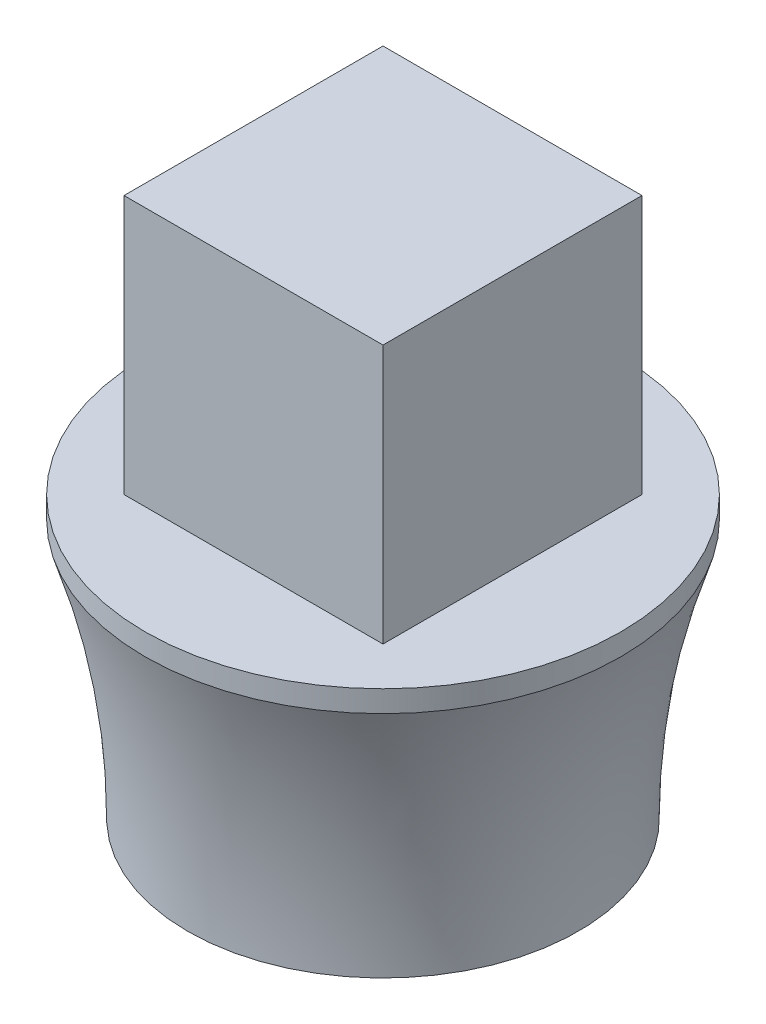
ISO-10303-21;
HEADER;
FILE_DESCRIPTION(('STEP AP214'),'2;1');
FILE_NAME('part.step','',(''),(''),'','','');
FILE_SCHEMA(('AUTOMOTIVE_DESIGN { 1 0 10303 214 1 1 1 1 }'));
ENDSEC;
DATA;
#1=APPLICATION_CONTEXT('core data for automotive mechanical design processes');
#2=APPLICATION_PROTOCOL_DEFINITION('international standard','automotive_design',2000,#1);
#3=PRODUCT_CONTEXT('',#1,'mechanical');
#4=PRODUCT('Part','Part','',(#3));
#5=PRODUCT_RELATED_PRODUCT_CATEGORY('part','',(#4));
#6=PRODUCT_DEFINITION_FORMATION('','',#4);
#7=PRODUCT_DEFINITION_CONTEXT('part definition',#1,'design');
#8=PRODUCT_DEFINITION('design','',#6,#7);
#9=PRODUCT_DEFINITION_SHAPE('','',#8);
#10=(LENGTH_UNIT() NAMED_UNIT(*) SI_UNIT(.MILLI.,.METRE.));
#11=(NAMED_UNIT(*) PLANE_ANGLE_UNIT() SI_UNIT($,.RADIAN.));
#12=(NAMED_UNIT(*) SI_UNIT($,.STERADIAN.) SOLID_ANGLE_UNIT());
#13=UNCERTAINTY_MEASURE_WITH_UNIT(LENGTH_MEASURE(1.E-05),#10,'distance_accuracy_value','');
#14=(GEOMETRIC_REPRESENTATION_CONTEXT(3) GLOBAL_UNCERTAINTY_ASSIGNED_CONTEXT((#13)) GLOBAL_UNIT_ASSIGNED_CONTEXT((#10,
#11,#12)) REPRESENTATION_CONTEXT('',''));
#15=CARTESIAN_POINT('',(0.,0.,0.));
#16=DIRECTION('',(0.,0.,1.));
#17=DIRECTION('',(1.,0.,0.));
#18=AXIS2_PLACEMENT_3D('',#15,#16,#17);
#19=CARTESIAN_POINT('',(55.,0.,0.));
#20=DIRECTION('',(0.,-1.,0.));
#21=DIRECTION('',(0.,0.,-1.));
#22=AXIS2_PLACEMENT_3D('',#19,#20,#21);
#23=PLANE('',#22);
#24=CARTESIAN_POINT('',(0.,0.,0.));
#25=DIRECTION('',(0.,-1.,0.));
#26=DIRECTION('',(0.,0.,-1.));
#27=AXIS2_PLACEMENT_3D('',#24,#25,#26);
#28=CIRCLE('',#27,57.5);
#29=CARTESIAN_POINT('',(0.,0.,-57.5));
#30=VERTEX_POINT('',#29);
#31=EDGE_CURVE('E124',#30,#30,#28,.T.);
#32=ORIENTED_EDGE('',*,*,#31,.T.);
#33=EDGE_LOOP('',(#32));
#34=FACE_BOUND('',#33,.T.);
#35=CARTESIAN_POINT('',(0.,0.,0.));
#36=DIRECTION('',(0.,-1.,0.));
#37=DIRECTION('',(0.,0.,-1.));
#38=AXIS2_PLACEMENT_3D('',#35,#36,#37);
#39=CIRCLE('',#38,55.);
#40=CARTESIAN_POINT('',(0.,0.,-55.));
#41=VERTEX_POINT('',#40);
#42=EDGE_CURVE('E11',#41,#41,#39,.T.);
#43=ORIENTED_EDGE('',*,*,#42,.F.);
#44=EDGE_LOOP('',(#43));
#45=FACE_BOUND('',#44,.T.);
#46=ADVANCED_FACE('F50',(#34,#45),#23,.T.);
#47=CARTESIAN_POINT('',(0.,0.,0.));
#48=DIRECTION('',(0.,-1.,0.));
#49=DIRECTION('',(0.,0.,-1.));
#50=AXIS2_PLACEMENT_3D('',#47,#48,#49);
#51=CYLINDRICAL_SURFACE('',#50,55.);
#52=CARTESIAN_POINT('',(0.,76.2,0.));
#53=DIRECTION('',(0.,-1.,0.));
#54=DIRECTION('',(0.,0.,-1.));
#55=AXIS2_PLACEMENT_3D('',#52,#53,#54);
#56=CIRCLE('',#55,55.);
#57=CARTESIAN_POINT('',(0.,76.2,-55.));
#58=VERTEX_POINT('',#57);
#59=EDGE_CURVE('E54',#58,#58,#56,.T.);
#60=ORIENTED_EDGE('',*,*,#59,.F.);
#61=EDGE_LOOP('',(#60));
#62=FACE_BOUND('',#61,.T.);
#63=ORIENTED_EDGE('',*,*,#42,.T.);
#64=EDGE_LOOP('',(#63));
#65=FACE_BOUND('',#64,.T.);
#66=ADVANCED_FACE('F131',(#62,#65),#51,.F.);
#67=CARTESIAN_POINT('',(0.,0.,0.));
#68=DIRECTION('',(0.,-1.,0.));
#69=DIRECTION('',(0.,0.,-1.));
#70=AXIS2_PLACEMENT_3D('',#67,#68,#69);
#71=TOROIDAL_SURFACE('',#70,296.0076,238.5076);
#72=CARTESIAN_POINT('',(0.,76.2,0.));
#73=DIRECTION('',(0.,1.,0.));
#74=DIRECTION('',(0.,0.,1.));
#75=AXIS2_PLACEMENT_3D('',#72,#73,#74);
#76=CIRCLE('',#75,70.);
#77=CARTESIAN_POINT('',(0.,76.2,70.));
#78=VERTEX_POINT('',#77);
#79=EDGE_CURVE('E112',#78,#78,#76,.T.);
#80=ORIENTED_EDGE('',*,*,#79,.F.);
#81=EDGE_LOOP('',(#80));
#82=FACE_BOUND('',#81,.T.);
#83=ORIENTED_EDGE('',*,*,#31,.F.);
#84=EDGE_LOOP('',(#83));
#85=FACE_BOUND('',#84,.T.);
#86=ADVANCED_FACE('F140',(#82,#85),#71,.F.);
#87=CARTESIAN_POINT('',(0.,76.2,0.));
#88=DIRECTION('',(0.,1.,0.));
#89=DIRECTION('',(0.,0.,1.));
#90=AXIS2_PLACEMENT_3D('',#87,#88,#89);
#91=PLANE('',#90);
#92=ORIENTED_EDGE('',*,*,#59,.T.);
#93=EDGE_LOOP('',(#92));
#94=FACE_BOUND('',#93,.T.);
#95=ADVANCED_FACE('F134',(#94),#91,.F.);
#96=CARTESIAN_POINT('',(0.,82.55,0.));
#97=DIRECTION('',(0.,-1.,0.));
#98=DIRECTION('',(0.,0.,-1.));
#99=AXIS2_PLACEMENT_3D('',#96,#97,#98);
#100=CYLINDRICAL_SURFACE('',#99,70.);
#101=CARTESIAN_POINT('',(0.,82.55,0.));
#102=DIRECTION('',(0.,1.,0.));
#103=DIRECTION('',(0.,0.,1.));
#104=AXIS2_PLACEMENT_3D('',#101,#102,#103);
#105=CIRCLE('',#104,70.);
#106=CARTESIAN_POINT('',(0.,82.55,70.));
#107=VERTEX_POINT('',#106);
#108=EDGE_CURVE('E117',#107,#107,#105,.T.);
#109=ORIENTED_EDGE('',*,*,#108,.F.);
#110=EDGE_LOOP('',(#109));
#111=FACE_BOUND('',#110,.T.);
#112=ORIENTED_EDGE('',*,*,#79,.T.);
#113=EDGE_LOOP('',(#112));
#114=FACE_BOUND('',#113,.T.);
#115=ADVANCED_FACE('F155',(#111,#114),#100,.T.);
#116=CARTESIAN_POINT('',(0.,82.55,0.));
#117=DIRECTION('',(0.,1.,0.));
#118=DIRECTION('',(0.,0.,1.));
#119=AXIS2_PLACEMENT_3D('',#116,#117,#118);
#120=PLANE('',#119);
#121=DIRECTION('',(0.,0.,-1.));
#122=VECTOR('',#121,1.);
#123=CARTESIAN_POINT('',(38.1,82.55,-38.1));
#124=LINE('',#123,#122);
#125=CARTESIAN_POINT('',(38.1,82.55,38.1));
#126=VERTEX_POINT('',#125);
#127=CARTESIAN_POINT('',(38.1,82.55,-38.1));
#128=VERTEX_POINT('',#127);
#129=EDGE_CURVE('E64',#126,#128,#124,.T.);
#130=ORIENTED_EDGE('',*,*,#129,.F.);
#131=DIRECTION('',(1.,0.,0.));
#132=VECTOR('',#131,1.);
#133=CARTESIAN_POINT('',(-38.1,82.55,38.1));
#134=LINE('',#133,#132);
#135=CARTESIAN_POINT('',(-38.1,82.55,38.1));
#136=VERTEX_POINT('',#135);
#137=EDGE_CURVE('E68',#136,#126,#134,.T.);
#138=ORIENTED_EDGE('',*,*,#137,.F.);
#139=DIRECTION('',(0.,0.,1.));
#140=VECTOR('',#139,1.);
#141=CARTESIAN_POINT('',(-38.1,82.55,-38.1));
#142=LINE('',#141,#140);
#143=CARTESIAN_POINT('',(-38.1,82.55,-38.1));
#144=VERTEX_POINT('',#143);
#145=EDGE_CURVE('E241',#144,#136,#142,.T.);
#146=ORIENTED_EDGE('',*,*,#145,.F.);
#147=DIRECTION('',(-1.,0.,0.));
#148=VECTOR('',#147,1.);
#149=CARTESIAN_POINT('',(-38.1,82.55,-38.1));
#150=LINE('',#149,#148);
#151=EDGE_CURVE('E255',#128,#144,#150,.T.);
#152=ORIENTED_EDGE('',*,*,#151,.F.);
#153=EDGE_LOOP('',(#130,#138,#146,#152));
#154=FACE_BOUND('',#153,.T.);
#155=ORIENTED_EDGE('',*,*,#108,.T.);
#156=EDGE_LOOP('',(#155));
#157=FACE_BOUND('',#156,.T.);
#158=ADVANCED_FACE('F160',(#154,#157),#120,.T.);
#159=CARTESIAN_POINT('',(38.1,158.75,-38.1));
#160=DIRECTION('',(-1.,0.,0.));
#161=DIRECTION('',(0.,0.,1.));
#162=AXIS2_PLACEMENT_3D('',#159,#160,#161);
#163=PLANE('',#162);
#164=ORIENTED_EDGE('',*,*,#129,.T.);
#165=DIRECTION('',(0.,-1.,0.));
#166=VECTOR('',#165,1.);
#167=CARTESIAN_POINT('',(38.1,158.75,-38.1));
#168=LINE('',#167,#166);
#169=CARTESIAN_POINT('',(38.1,158.75,-38.1));
#170=VERTEX_POINT('',#169);
#171=EDGE_CURVE('E93',#170,#128,#168,.T.);
#172=ORIENTED_EDGE('',*,*,#171,.F.);
#173=DIRECTION('',(0.,0.,-1.));
#174=VECTOR('',#173,1.);
#175=CARTESIAN_POINT('',(38.1,158.75,-38.1));
#176=LINE('',#175,#174);
#177=CARTESIAN_POINT('',(38.1,158.75,38.1));
#178=VERTEX_POINT('',#177);
#179=EDGE_CURVE('E98',#178,#170,#176,.T.);
#180=ORIENTED_EDGE('',*,*,#179,.F.);
#181=DIRECTION('',(0.,-1.,0.));
#182=VECTOR('',#181,1.);
#183=CARTESIAN_POINT('',(38.1,158.75,38.1));
#184=LINE('',#183,#182);
#185=EDGE_CURVE('E242',#178,#126,#184,.T.);
#186=ORIENTED_EDGE('',*,*,#185,.T.);
#187=EDGE_LOOP('',(#164,#172,#180,#186));
#188=FACE_BOUND('',#187,.T.);
#189=ADVANCED_FACE('F108',(#188),#163,.F.);
#190=CARTESIAN_POINT('',(-38.1,158.75,-38.1));
#191=DIRECTION('',(0.,0.,1.));
#192=DIRECTION('',(1.,0.,0.));
#193=AXIS2_PLACEMENT_3D('',#190,#191,#192);
#194=PLANE('',#193);
#195=ORIENTED_EDGE('',*,*,#151,.T.);
#196=DIRECTION('',(0.,-1.,0.));
#197=VECTOR('',#196,1.);
#198=CARTESIAN_POINT('',(-38.1,158.75,-38.1));
#199=LINE('',#198,#197);
#200=CARTESIAN_POINT('',(-38.1,158.75,-38.1));
#201=VERTEX_POINT('',#200);
#202=EDGE_CURVE('E91',#201,#144,#199,.T.);
#203=ORIENTED_EDGE('',*,*,#202,.F.);
#204=DIRECTION('',(-1.,0.,0.));
#205=VECTOR('',#204,1.);
#206=CARTESIAN_POINT('',(-38.1,158.75,-38.1));
#207=LINE('',#206,#205);
#208=EDGE_CURVE('E88',#170,#201,#207,.T.);
#209=ORIENTED_EDGE('',*,*,#208,.F.);
#210=ORIENTED_EDGE('',*,*,#171,.T.);
#211=EDGE_LOOP('',(#195,#203,#209,#210));
#212=FACE_BOUND('',#211,.T.);
#213=ADVANCED_FACE('F90',(#212),#194,.F.);
#214=CARTESIAN_POINT('',(-38.1,158.75,-38.1));
#215=DIRECTION('',(1.,0.,0.));
#216=DIRECTION('',(0.,0.,-1.));
#217=AXIS2_PLACEMENT_3D('',#214,#215,#216);
#218=PLANE('',#217);
#219=ORIENTED_EDGE('',*,*,#145,.T.);
#220=DIRECTION('',(0.,-1.,0.));
#221=VECTOR('',#220,1.);
#222=CARTESIAN_POINT('',(-38.1,158.75,38.1));
#223=LINE('',#222,#221);
#224=CARTESIAN_POINT('',(-38.1,158.75,38.1));
#225=VERTEX_POINT('',#224);
#226=EDGE_CURVE('E120',#225,#136,#223,.T.);
#227=ORIENTED_EDGE('',*,*,#226,.F.);
#228=DIRECTION('',(0.,0.,1.));
#229=VECTOR('',#228,1.);
#230=CARTESIAN_POINT('',(-38.1,158.75,-38.1));
#231=LINE('',#230,#229);
#232=EDGE_CURVE('E100',#201,#225,#231,.T.);
#233=ORIENTED_EDGE('',*,*,#232,.F.);
#234=ORIENTED_EDGE('',*,*,#202,.T.);
#235=EDGE_LOOP('',(#219,#227,#233,#234));
#236=FACE_BOUND('',#235,.T.);
#237=ADVANCED_FACE('F167',(#236),#218,.F.);
#238=CARTESIAN_POINT('',(-38.1,158.75,38.1));
#239=DIRECTION('',(0.,0.,-1.));
#240=DIRECTION('',(-1.,0.,0.));
#241=AXIS2_PLACEMENT_3D('',#238,#239,#240);
#242=PLANE('',#241);
#243=ORIENTED_EDGE('',*,*,#137,.T.);
#244=ORIENTED_EDGE('',*,*,#185,.F.);
#245=DIRECTION('',(1.,0.,0.));
#246=VECTOR('',#245,1.);
#247=CARTESIAN_POINT('',(-38.1,158.75,38.1));
#248=LINE('',#247,#246);
#249=EDGE_CURVE('E103',#225,#178,#248,.T.);
#250=ORIENTED_EDGE('',*,*,#249,.F.);
#251=ORIENTED_EDGE('',*,*,#226,.T.);
#252=EDGE_LOOP('',(#243,#244,#250,#251));
#253=FACE_BOUND('',#252,.T.);
#254=ADVANCED_FACE('F166',(#253),#242,.F.);
#255=CARTESIAN_POINT('',(0.,158.75,0.));
#256=DIRECTION('',(0.,1.,0.));
#257=DIRECTION('',(0.,0.,1.));
#258=AXIS2_PLACEMENT_3D('',#255,#256,#257);
#259=PLANE('',#258);
#260=ORIENTED_EDGE('',*,*,#179,.T.);
#261=ORIENTED_EDGE('',*,*,#208,.T.);
#262=ORIENTED_EDGE('',*,*,#232,.T.);
#263=ORIENTED_EDGE('',*,*,#249,.T.);
#264=EDGE_LOOP('',(#260,#261,#262,#263));
#265=FACE_BOUND('',#264,.T.);
#266=ADVANCED_FACE('F101',(#265),#259,.T.);
#267=CLOSED_SHELL('',(#46,#66,#86,#95,#115,#158,#189,#213,#237,#254,#266));
#268=MANIFOLD_SOLID_BREP('B2',#267);
#269=ADVANCED_BREP_SHAPE_REPRESENTATION('',(#18,#268),#14);
#270=SHAPE_DEFINITION_REPRESENTATION(#9,#269);
ENDSEC;
END-ISO-10303-21;
